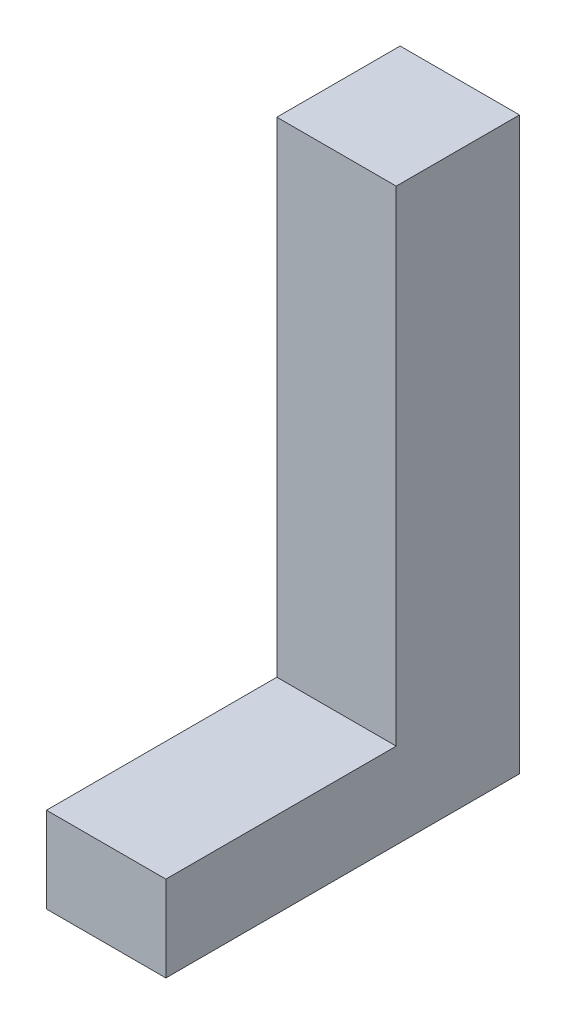
ISO-10303-21;
HEADER;
FILE_DESCRIPTION(('STEP AP214'),'2;1');
FILE_NAME('part.step','',(''),(''),'','','');
FILE_SCHEMA(('AUTOMOTIVE_DESIGN { 1 0 10303 214 1 1 1 1 }'));
ENDSEC;
DATA;
#1=APPLICATION_CONTEXT('core data for automotive mechanical design processes');
#2=APPLICATION_PROTOCOL_DEFINITION('international standard','automotive_design',2000,#1);
#3=PRODUCT_CONTEXT('',#1,'mechanical');
#4=PRODUCT('Part','Part','',(#3));
#5=PRODUCT_RELATED_PRODUCT_CATEGORY('part','',(#4));
#6=PRODUCT_DEFINITION_FORMATION('','',#4);
#7=PRODUCT_DEFINITION_CONTEXT('part definition',#1,'design');
#8=PRODUCT_DEFINITION('design','',#6,#7);
#9=PRODUCT_DEFINITION_SHAPE('','',#8);
#10=(LENGTH_UNIT() NAMED_UNIT(*) SI_UNIT(.MILLI.,.METRE.));
#11=(NAMED_UNIT(*) PLANE_ANGLE_UNIT() SI_UNIT($,.RADIAN.));
#12=(NAMED_UNIT(*) SI_UNIT($,.STERADIAN.) SOLID_ANGLE_UNIT());
#13=UNCERTAINTY_MEASURE_WITH_UNIT(LENGTH_MEASURE(1.E-05),#10,'distance_accuracy_value','');
#14=(GEOMETRIC_REPRESENTATION_CONTEXT(3) GLOBAL_UNCERTAINTY_ASSIGNED_CONTEXT((#13)) GLOBAL_UNIT_ASSIGNED_CONTEXT((#10,
#11,#12)) REPRESENTATION_CONTEXT('',''));
#15=CARTESIAN_POINT('',(0.,0.,0.));
#16=DIRECTION('',(0.,0.,1.));
#17=DIRECTION('',(1.,0.,0.));
#18=AXIS2_PLACEMENT_3D('',#15,#16,#17);
#19=CARTESIAN_POINT('',(-160.,104.,-485.244512898048));
#20=DIRECTION('',(0.,-1.,0.));
#21=DIRECTION('',(0.,0.,-1.));
#22=AXIS2_PLACEMENT_3D('',#19,#20,#21);
#23=PLANE('',#22);
#24=DIRECTION('',(1.,0.,0.));
#25=VECTOR('',#24,1.);
#26=CARTESIAN_POINT('',(-160.,104.,-335.50693683128));
#27=LINE('',#26,#25);
#28=CARTESIAN_POINT('',(-305.,104.,-335.50693683128));
#29=VERTEX_POINT('',#28);
#30=CARTESIAN_POINT('',(-160.,104.,-335.50693683128));
#31=VERTEX_POINT('',#30);
#32=EDGE_CURVE('E50',#29,#31,#27,.T.);
#33=ORIENTED_EDGE('',*,*,#32,.F.);
#34=DIRECTION('',(0.,0.,1.));
#35=VECTOR('',#34,1.);
#36=CARTESIAN_POINT('',(-305.,104.,-485.244512898048));
#37=LINE('',#36,#35);
#38=CARTESIAN_POINT('',(-305.,104.,-55.73));
#39=VERTEX_POINT('',#38);
#40=EDGE_CURVE('E86',#29,#39,#37,.T.);
#41=ORIENTED_EDGE('',*,*,#40,.T.);
#42=DIRECTION('',(1.,0.,0.));
#43=VECTOR('',#42,1.);
#44=CARTESIAN_POINT('',(-160.,104.,-55.73));
#45=LINE('',#44,#43);
#46=CARTESIAN_POINT('',(-160.,104.,-55.73));
#47=VERTEX_POINT('',#46);
#48=EDGE_CURVE('E90',#39,#47,#45,.T.);
#49=ORIENTED_EDGE('',*,*,#48,.T.);
#50=DIRECTION('',(0.,0.,1.));
#51=VECTOR('',#50,1.);
#52=CARTESIAN_POINT('',(-160.,104.,-485.244512898048));
#53=LINE('',#52,#51);
#54=EDGE_CURVE('E77',#31,#47,#53,.T.);
#55=ORIENTED_EDGE('',*,*,#54,.F.);
#56=EDGE_LOOP('',(#33,#41,#49,#55));
#57=FACE_BOUND('',#56,.T.);
#58=ADVANCED_FACE('F33',(#57),#23,.F.);
#59=CARTESIAN_POINT('',(-160.,104.,-485.244512898048));
#60=DIRECTION('',(-1.,0.,0.));
#61=DIRECTION('',(0.,0.,1.));
#62=AXIS2_PLACEMENT_3D('',#59,#60,#61);
#63=PLANE('',#62);
#64=DIRECTION('',(0.,-1.,0.));
#65=VECTOR('',#64,1.);
#66=CARTESIAN_POINT('',(-160.,104.,-55.73));
#67=LINE('',#66,#65);
#68=CARTESIAN_POINT('',(-160.,0.,-55.73));
#69=VERTEX_POINT('',#68);
#70=EDGE_CURVE('E81',#47,#69,#67,.T.);
#71=ORIENTED_EDGE('',*,*,#70,.T.);
#72=DIRECTION('',(0.,0.,1.));
#73=VECTOR('',#72,1.);
#74=CARTESIAN_POINT('',(-160.,0.,-485.244512898048));
#75=LINE('',#74,#73);
#76=CARTESIAN_POINT('',(-160.,0.,-485.244512898048));
#77=VERTEX_POINT('',#76);
#78=EDGE_CURVE('E11',#77,#69,#75,.T.);
#79=ORIENTED_EDGE('',*,*,#78,.F.);
#80=DIRECTION('',(0.,-1.,0.));
#81=VECTOR('',#80,1.);
#82=CARTESIAN_POINT('',(-160.,104.,-485.244512898048));
#83=LINE('',#82,#81);
#84=CARTESIAN_POINT('',(-160.,693.026512898048,-485.244512898048));
#85=VERTEX_POINT('',#84);
#86=EDGE_CURVE('E94',#85,#77,#83,.T.);
#87=ORIENTED_EDGE('',*,*,#86,.F.);
#88=DIRECTION('',(0.,0.,-1.));
#89=VECTOR('',#88,1.);
#90=CARTESIAN_POINT('',(-160.,693.026512898048,-485.244512898048));
#91=LINE('',#90,#89);
#92=CARTESIAN_POINT('',(-160.,693.026512898048,-335.50693683128));
#93=VERTEX_POINT('',#92);
#94=EDGE_CURVE('E115',#93,#85,#91,.T.);
#95=ORIENTED_EDGE('',*,*,#94,.F.);
#96=DIRECTION('',(0.,-1.,0.));
#97=VECTOR('',#96,1.);
#98=CARTESIAN_POINT('',(-160.,693.026512898048,-335.50693683128));
#99=LINE('',#98,#97);
#100=EDGE_CURVE('E85',#93,#31,#99,.T.);
#101=ORIENTED_EDGE('',*,*,#100,.T.);
#102=ORIENTED_EDGE('',*,*,#54,.T.);
#103=EDGE_LOOP('',(#71,#79,#87,#95,#101,#102));
#104=FACE_BOUND('',#103,.T.);
#105=ADVANCED_FACE('F35',(#104),#63,.F.);
#106=CARTESIAN_POINT('',(-160.,0.,-485.244512898048));
#107=DIRECTION('',(0.,1.,0.));
#108=DIRECTION('',(0.,0.,1.));
#109=AXIS2_PLACEMENT_3D('',#106,#107,#108);
#110=PLANE('',#109);
#111=DIRECTION('',(-1.,0.,0.));
#112=VECTOR('',#111,1.);
#113=CARTESIAN_POINT('',(-160.,0.,-55.73));
#114=LINE('',#113,#112);
#115=CARTESIAN_POINT('',(-305.,0.,-55.73));
#116=VERTEX_POINT('',#115);
#117=EDGE_CURVE('E98',#69,#116,#114,.T.);
#118=ORIENTED_EDGE('',*,*,#117,.T.);
#119=DIRECTION('',(0.,0.,1.));
#120=VECTOR('',#119,1.);
#121=CARTESIAN_POINT('',(-305.,0.,-485.244512898048));
#122=LINE('',#121,#120);
#123=CARTESIAN_POINT('',(-305.,0.,-485.244512898048));
#124=VERTEX_POINT('',#123);
#125=EDGE_CURVE('E42',#124,#116,#122,.T.);
#126=ORIENTED_EDGE('',*,*,#125,.F.);
#127=DIRECTION('',(-1.,0.,0.));
#128=VECTOR('',#127,1.);
#129=CARTESIAN_POINT('',(-160.,0.,-485.244512898048));
#130=LINE('',#129,#128);
#131=EDGE_CURVE('E59',#77,#124,#130,.T.);
#132=ORIENTED_EDGE('',*,*,#131,.F.);
#133=ORIENTED_EDGE('',*,*,#78,.T.);
#134=EDGE_LOOP('',(#118,#126,#132,#133));
#135=FACE_BOUND('',#134,.T.);
#136=ADVANCED_FACE('F152',(#135),#110,.F.);
#137=CARTESIAN_POINT('',(-305.,104.,-485.244512898048));
#138=DIRECTION('',(1.,0.,0.));
#139=DIRECTION('',(0.,0.,-1.));
#140=AXIS2_PLACEMENT_3D('',#137,#138,#139);
#141=PLANE('',#140);
#142=DIRECTION('',(0.,1.,0.));
#143=VECTOR('',#142,1.);
#144=CARTESIAN_POINT('',(-305.,104.,-55.73));
#145=LINE('',#144,#143);
#146=EDGE_CURVE('E95',#116,#39,#145,.T.);
#147=ORIENTED_EDGE('',*,*,#146,.T.);
#148=ORIENTED_EDGE('',*,*,#40,.F.);
#149=DIRECTION('',(0.,-1.,0.));
#150=VECTOR('',#149,1.);
#151=CARTESIAN_POINT('',(-305.,693.026512898048,-335.50693683128));
#152=LINE('',#151,#150);
#153=CARTESIAN_POINT('',(-305.,693.026512898048,-335.50693683128));
#154=VERTEX_POINT('',#153);
#155=EDGE_CURVE('E99',#154,#29,#152,.T.);
#156=ORIENTED_EDGE('',*,*,#155,.F.);
#157=DIRECTION('',(0.,0.,1.));
#158=VECTOR('',#157,1.);
#159=CARTESIAN_POINT('',(-305.,693.026512898048,-485.244512898048));
#160=LINE('',#159,#158);
#161=CARTESIAN_POINT('',(-305.,693.026512898048,-485.244512898048));
#162=VERTEX_POINT('',#161);
#163=EDGE_CURVE('E139',#162,#154,#160,.T.);
#164=ORIENTED_EDGE('',*,*,#163,.F.);
#165=DIRECTION('',(0.,1.,0.));
#166=VECTOR('',#165,1.);
#167=CARTESIAN_POINT('',(-305.,104.,-485.244512898048));
#168=LINE('',#167,#166);
#169=EDGE_CURVE('E87',#124,#162,#168,.T.);
#170=ORIENTED_EDGE('',*,*,#169,.F.);
#171=ORIENTED_EDGE('',*,*,#125,.T.);
#172=EDGE_LOOP('',(#147,#148,#156,#164,#170,#171));
#173=FACE_BOUND('',#172,.T.);
#174=ADVANCED_FACE('F142',(#173),#141,.F.);
#175=CARTESIAN_POINT('',(0.,0.,-485.244512898048));
#176=DIRECTION('',(0.,0.,-1.));
#177=DIRECTION('',(-1.,0.,0.));
#178=AXIS2_PLACEMENT_3D('',#175,#176,#177);
#179=PLANE('',#178);
#180=ORIENTED_EDGE('',*,*,#86,.T.);
#181=ORIENTED_EDGE('',*,*,#131,.T.);
#182=ORIENTED_EDGE('',*,*,#169,.T.);
#183=DIRECTION('',(-1.,0.,0.));
#184=VECTOR('',#183,1.);
#185=CARTESIAN_POINT('',(-160.,693.026512898048,-485.244512898048));
#186=LINE('',#185,#184);
#187=EDGE_CURVE('E128',#85,#162,#186,.T.);
#188=ORIENTED_EDGE('',*,*,#187,.F.);
#189=EDGE_LOOP('',(#180,#181,#182,#188));
#190=FACE_BOUND('',#189,.T.);
#191=ADVANCED_FACE('F126',(#190),#179,.T.);
#192=CARTESIAN_POINT('',(0.,0.,-55.73));
#193=DIRECTION('',(0.,0.,-1.));
#194=DIRECTION('',(-1.,0.,0.));
#195=AXIS2_PLACEMENT_3D('',#192,#193,#194);
#196=PLANE('',#195);
#197=ORIENTED_EDGE('',*,*,#70,.F.);
#198=ORIENTED_EDGE('',*,*,#48,.F.);
#199=ORIENTED_EDGE('',*,*,#146,.F.);
#200=ORIENTED_EDGE('',*,*,#117,.F.);
#201=EDGE_LOOP('',(#197,#198,#199,#200));
#202=FACE_BOUND('',#201,.T.);
#203=ADVANCED_FACE('F97',(#202),#196,.F.);
#204=CARTESIAN_POINT('',(-160.,693.026512898048,-335.50693683128));
#205=DIRECTION('',(0.,0.,-1.));
#206=DIRECTION('',(-1.,0.,0.));
#207=AXIS2_PLACEMENT_3D('',#204,#205,#206);
#208=PLANE('',#207);
#209=ORIENTED_EDGE('',*,*,#32,.T.);
#210=ORIENTED_EDGE('',*,*,#100,.F.);
#211=DIRECTION('',(1.,0.,0.));
#212=VECTOR('',#211,1.);
#213=CARTESIAN_POINT('',(-160.,693.026512898048,-335.50693683128));
#214=LINE('',#213,#212);
#215=EDGE_CURVE('E120',#154,#93,#214,.T.);
#216=ORIENTED_EDGE('',*,*,#215,.F.);
#217=ORIENTED_EDGE('',*,*,#155,.T.);
#218=EDGE_LOOP('',(#209,#210,#216,#217));
#219=FACE_BOUND('',#218,.T.);
#220=ADVANCED_FACE('F147',(#219),#208,.F.);
#221=CARTESIAN_POINT('',(0.,693.026512898048,0.));
#222=DIRECTION('',(0.,-1.,0.));
#223=DIRECTION('',(0.,0.,-1.));
#224=AXIS2_PLACEMENT_3D('',#221,#222,#223);
#225=PLANE('',#224);
#226=ORIENTED_EDGE('',*,*,#94,.T.);
#227=ORIENTED_EDGE('',*,*,#187,.T.);
#228=ORIENTED_EDGE('',*,*,#163,.T.);
#229=ORIENTED_EDGE('',*,*,#215,.T.);
#230=EDGE_LOOP('',(#226,#227,#228,#229));
#231=FACE_BOUND('',#230,.T.);
#232=ADVANCED_FACE('F137',(#231),#225,.F.);
#233=CLOSED_SHELL('',(#58,#105,#136,#174,#191,#203,#220,#232));
#234=MANIFOLD_SOLID_BREP('B2',#233);
#235=ADVANCED_BREP_SHAPE_REPRESENTATION('',(#18,#234),#14);
#236=SHAPE_DEFINITION_REPRESENTATION(#9,#235);
ENDSEC;
END-ISO-10303-21;
